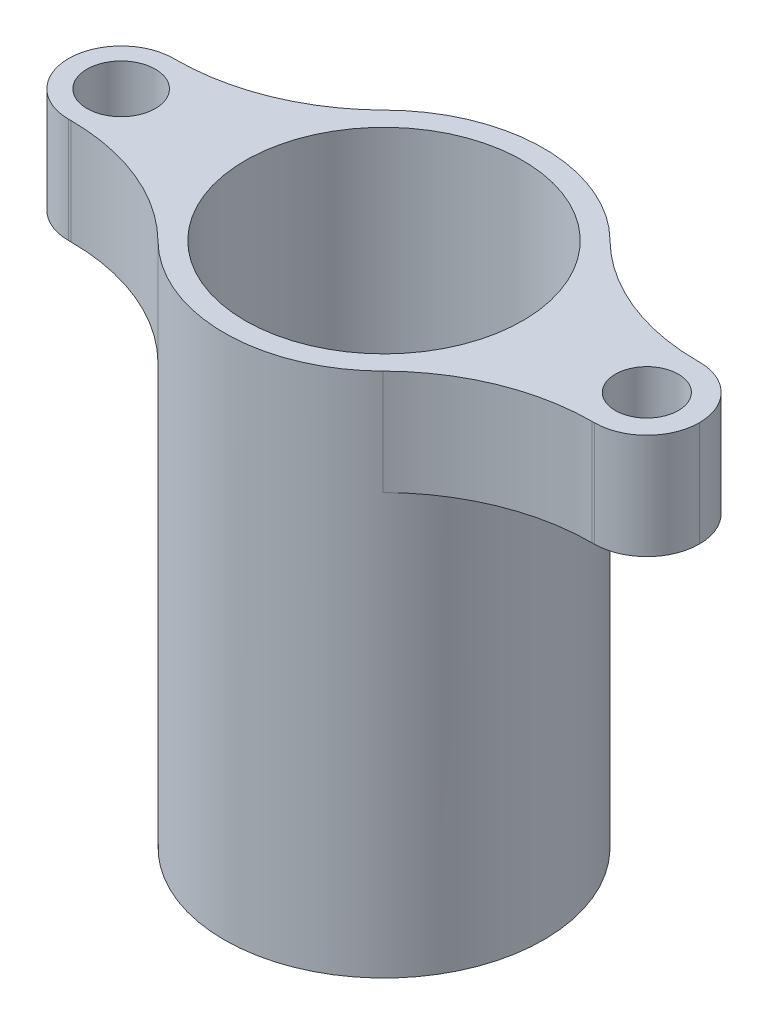
ISO-10303-21;
HEADER;
FILE_DESCRIPTION(('STEP AP214'),'2;1');
FILE_NAME('part.step','',(''),(''),'','','');
FILE_SCHEMA(('AUTOMOTIVE_DESIGN { 1 0 10303 214 1 1 1 1 }'));
ENDSEC;
DATA;
#1=APPLICATION_CONTEXT('core data for automotive mechanical design processes');
#2=APPLICATION_PROTOCOL_DEFINITION('international standard','automotive_design',2000,#1);
#3=PRODUCT_CONTEXT('',#1,'mechanical');
#4=PRODUCT('Part','Part','',(#3));
#5=PRODUCT_RELATED_PRODUCT_CATEGORY('part','',(#4));
#6=PRODUCT_DEFINITION_FORMATION('','',#4);
#7=PRODUCT_DEFINITION_CONTEXT('part definition',#1,'design');
#8=PRODUCT_DEFINITION('design','',#6,#7);
#9=PRODUCT_DEFINITION_SHAPE('','',#8);
#10=(LENGTH_UNIT() NAMED_UNIT(*) SI_UNIT(.MILLI.,.METRE.));
#11=(NAMED_UNIT(*) PLANE_ANGLE_UNIT() SI_UNIT($,.RADIAN.));
#12=(NAMED_UNIT(*) SI_UNIT($,.STERADIAN.) SOLID_ANGLE_UNIT());
#13=UNCERTAINTY_MEASURE_WITH_UNIT(LENGTH_MEASURE(1.E-05),#10,'distance_accuracy_value','');
#14=(GEOMETRIC_REPRESENTATION_CONTEXT(3) GLOBAL_UNCERTAINTY_ASSIGNED_CONTEXT((#13)) GLOBAL_UNIT_ASSIGNED_CONTEXT((#10,
#11,#12)) REPRESENTATION_CONTEXT('',''));
#15=CARTESIAN_POINT('',(0.,0.,0.));
#16=DIRECTION('',(0.,0.,1.));
#17=DIRECTION('',(1.,0.,0.));
#18=AXIS2_PLACEMENT_3D('',#15,#16,#17);
#19=CARTESIAN_POINT('',(0.,25.,0.));
#20=DIRECTION('',(0.,1.,0.));
#21=DIRECTION('',(0.,0.,1.));
#22=AXIS2_PLACEMENT_3D('',#19,#20,#21);
#23=PLANE('',#22);
#24=DIRECTION('',(1.,0.,0.));
#25=VECTOR('',#24,1.);
#26=CARTESIAN_POINT('',(15.,25.,2.5));
#27=LINE('',#26,#25);
#28=CARTESIAN_POINT('',(12.3899152539475,25.,2.5));
#29=VERTEX_POINT('',#28);
#30=CARTESIAN_POINT('',(12.5,25.,2.5));
#31=VERTEX_POINT('',#30);
#32=EDGE_CURVE('E333',#29,#31,#27,.T.);
#33=ORIENTED_EDGE('',*,*,#32,.T.);
#34=CARTESIAN_POINT('',(12.5,25.,0.));
#35=DIRECTION('',(0.,1.,0.));
#36=DIRECTION('',(0.,0.,1.));
#37=AXIS2_PLACEMENT_3D('',#34,#35,#36);
#38=CIRCLE('',#37,2.5);
#39=CARTESIAN_POINT('',(15.,25.,0.));
#40=VERTEX_POINT('',#39);
#41=EDGE_CURVE('E233',#31,#40,#38,.T.);
#42=ORIENTED_EDGE('',*,*,#41,.T.);
#43=CARTESIAN_POINT('',(12.5,25.,0.));
#44=DIRECTION('',(0.,1.,0.));
#45=DIRECTION('',(0.,0.,1.));
#46=AXIS2_PLACEMENT_3D('',#43,#44,#45);
#47=CIRCLE('',#46,2.5);
#48=CARTESIAN_POINT('',(12.5,25.,-2.5));
#49=VERTEX_POINT('',#48);
#50=EDGE_CURVE('E230',#40,#49,#47,.T.);
#51=ORIENTED_EDGE('',*,*,#50,.T.);
#52=DIRECTION('',(-1.,0.,0.));
#53=VECTOR('',#52,1.);
#54=CARTESIAN_POINT('',(15.,25.,-2.5));
#55=LINE('',#54,#53);
#56=CARTESIAN_POINT('',(12.3899152539475,25.,-2.5));
#57=VERTEX_POINT('',#56);
#58=EDGE_CURVE('E315',#49,#57,#55,.T.);
#59=ORIENTED_EDGE('',*,*,#58,.T.);
#60=CARTESIAN_POINT('',(12.3899152539475,25.,-12.5));
#61=DIRECTION('',(0.,1.,0.));
#62=DIRECTION('',(0.,0.,1.));
#63=AXIS2_PLACEMENT_3D('',#60,#61,#62);
#64=CIRCLE('',#63,10.);
#65=CARTESIAN_POINT('',(5.35019067784095,25.,-5.39772727272727));
#66=VERTEX_POINT('',#65);
#67=EDGE_CURVE('E210',#57,#66,#64,.F.);
#68=ORIENTED_EDGE('',*,*,#67,.T.);
#69=CARTESIAN_POINT('',(0.,25.,0.));
#70=DIRECTION('',(0.,1.,0.));
#71=DIRECTION('',(0.,0.,1.));
#72=AXIS2_PLACEMENT_3D('',#69,#70,#71);
#73=CIRCLE('',#72,7.6);
#74=CARTESIAN_POINT('',(-5.35019067784095,25.,-5.39772727272727));
#75=VERTEX_POINT('',#74);
#76=EDGE_CURVE('E170',#66,#75,#73,.T.);
#77=ORIENTED_EDGE('',*,*,#76,.T.);
#78=CARTESIAN_POINT('',(-12.3899152539475,25.,-12.5));
#79=DIRECTION('',(0.,1.,0.));
#80=DIRECTION('',(0.,0.,1.));
#81=AXIS2_PLACEMENT_3D('',#78,#79,#80);
#82=CIRCLE('',#81,10.);
#83=CARTESIAN_POINT('',(-12.3899152539475,25.,-2.5));
#84=VERTEX_POINT('',#83);
#85=EDGE_CURVE('E213',#75,#84,#82,.F.);
#86=ORIENTED_EDGE('',*,*,#85,.T.);
#87=DIRECTION('',(-1.,0.,0.));
#88=VECTOR('',#87,1.);
#89=CARTESIAN_POINT('',(-6.10819122163018,25.,-2.5));
#90=LINE('',#89,#88);
#91=CARTESIAN_POINT('',(-12.5,25.,-2.5));
#92=VERTEX_POINT('',#91);
#93=EDGE_CURVE('E277',#84,#92,#90,.T.);
#94=ORIENTED_EDGE('',*,*,#93,.T.);
#95=CARTESIAN_POINT('',(-12.5,25.,0.));
#96=DIRECTION('',(0.,1.,0.));
#97=DIRECTION('',(0.,0.,1.));
#98=AXIS2_PLACEMENT_3D('',#95,#96,#97);
#99=CIRCLE('',#98,2.5);
#100=CARTESIAN_POINT('',(-15.,25.,0.));
#101=VERTEX_POINT('',#100);
#102=EDGE_CURVE('E224',#92,#101,#99,.T.);
#103=ORIENTED_EDGE('',*,*,#102,.T.);
#104=CARTESIAN_POINT('',(-12.5,25.,0.));
#105=DIRECTION('',(0.,1.,0.));
#106=DIRECTION('',(0.,0.,1.));
#107=AXIS2_PLACEMENT_3D('',#104,#105,#106);
#108=CIRCLE('',#107,2.5);
#109=CARTESIAN_POINT('',(-12.5,25.,2.5));
#110=VERTEX_POINT('',#109);
#111=EDGE_CURVE('E227',#101,#110,#108,.T.);
#112=ORIENTED_EDGE('',*,*,#111,.T.);
#113=DIRECTION('',(1.,0.,0.));
#114=VECTOR('',#113,1.);
#115=CARTESIAN_POINT('',(-6.10819122163018,25.,2.5));
#116=LINE('',#115,#114);
#117=CARTESIAN_POINT('',(-12.3899152539475,25.,2.5));
#118=VERTEX_POINT('',#117);
#119=EDGE_CURVE('E151',#110,#118,#116,.T.);
#120=ORIENTED_EDGE('',*,*,#119,.T.);
#121=CARTESIAN_POINT('',(-12.3899152539475,25.,12.5));
#122=DIRECTION('',(0.,1.,0.));
#123=DIRECTION('',(0.,0.,1.));
#124=AXIS2_PLACEMENT_3D('',#121,#122,#123);
#125=CIRCLE('',#124,10.);
#126=CARTESIAN_POINT('',(-5.35019067784095,25.,5.39772727272727));
#127=VERTEX_POINT('',#126);
#128=EDGE_CURVE('E145',#118,#127,#125,.F.);
#129=ORIENTED_EDGE('',*,*,#128,.T.);
#130=CARTESIAN_POINT('',(5.35019067784095,25.,5.39772727272727));
#131=VERTEX_POINT('',#130);
#132=EDGE_CURVE('E149',#127,#131,#73,.T.);
#133=ORIENTED_EDGE('',*,*,#132,.T.);
#134=CARTESIAN_POINT('',(12.3899152539475,25.,12.5));
#135=DIRECTION('',(0.,1.,0.));
#136=DIRECTION('',(0.,0.,1.));
#137=AXIS2_PLACEMENT_3D('',#134,#135,#136);
#138=CIRCLE('',#137,10.);
#139=EDGE_CURVE('E198',#131,#29,#138,.F.);
#140=ORIENTED_EDGE('',*,*,#139,.T.);
#141=EDGE_LOOP('',(#33,#42,#51,#59,#68,#77,#86,#94,#103,#112,#120,#129,#133,#140));
#142=FACE_BOUND('',#141,.T.);
#143=CARTESIAN_POINT('',(0.,25.,0.));
#144=DIRECTION('',(0.,1.,0.));
#145=DIRECTION('',(0.,0.,1.));
#146=AXIS2_PLACEMENT_3D('',#143,#144,#145);
#147=CIRCLE('',#146,6.6);
#148=CARTESIAN_POINT('',(0.,25.,6.6));
#149=VERTEX_POINT('',#148);
#150=EDGE_CURVE('E295',#149,#149,#147,.T.);
#151=ORIENTED_EDGE('',*,*,#150,.F.);
#152=EDGE_LOOP('',(#151));
#153=FACE_BOUND('',#152,.T.);
#154=CARTESIAN_POINT('',(-12.5,25.,0.));
#155=DIRECTION('',(0.,1.,0.));
#156=DIRECTION('',(0.,0.,1.));
#157=AXIS2_PLACEMENT_3D('',#154,#155,#156);
#158=CIRCLE('',#157,1.625);
#159=CARTESIAN_POINT('',(-12.5,25.,1.625));
#160=VERTEX_POINT('',#159);
#161=EDGE_CURVE('E323',#160,#160,#158,.T.);
#162=ORIENTED_EDGE('',*,*,#161,.F.);
#163=EDGE_LOOP('',(#162));
#164=FACE_BOUND('',#163,.T.);
#165=CARTESIAN_POINT('',(12.5,25.,0.));
#166=DIRECTION('',(0.,1.,0.));
#167=DIRECTION('',(0.,0.,1.));
#168=AXIS2_PLACEMENT_3D('',#165,#166,#167);
#169=CIRCLE('',#168,1.5);
#170=CARTESIAN_POINT('',(12.5,25.,1.5));
#171=VERTEX_POINT('',#170);
#172=EDGE_CURVE('E324',#171,#171,#169,.T.);
#173=ORIENTED_EDGE('',*,*,#172,.F.);
#174=EDGE_LOOP('',(#173));
#175=FACE_BOUND('',#174,.T.);
#176=ADVANCED_FACE('F44',(#142,#153,#164,#175),#23,.T.);
#177=CARTESIAN_POINT('',(0.,0.,0.));
#178=DIRECTION('',(0.,1.,0.));
#179=DIRECTION('',(0.,0.,1.));
#180=AXIS2_PLACEMENT_3D('',#177,#178,#179);
#181=PLANE('',#180);
#182=CARTESIAN_POINT('',(0.,0.,0.));
#183=DIRECTION('',(0.,1.,0.));
#184=DIRECTION('',(0.,0.,1.));
#185=AXIS2_PLACEMENT_3D('',#182,#183,#184);
#186=CIRCLE('',#185,7.6);
#187=CARTESIAN_POINT('',(0.,0.,7.6));
#188=VERTEX_POINT('',#187);
#189=EDGE_CURVE('E299',#188,#188,#186,.T.);
#190=ORIENTED_EDGE('',*,*,#189,.F.);
#191=EDGE_LOOP('',(#190));
#192=FACE_BOUND('',#191,.T.);
#193=CARTESIAN_POINT('',(0.,0.,0.));
#194=DIRECTION('',(0.,1.,0.));
#195=DIRECTION('',(0.,0.,1.));
#196=AXIS2_PLACEMENT_3D('',#193,#194,#195);
#197=CIRCLE('',#196,6.6);
#198=CARTESIAN_POINT('',(0.,0.,6.6));
#199=VERTEX_POINT('',#198);
#200=EDGE_CURVE('E294',#199,#199,#197,.T.);
#201=ORIENTED_EDGE('',*,*,#200,.T.);
#202=EDGE_LOOP('',(#201));
#203=FACE_BOUND('',#202,.T.);
#204=ADVANCED_FACE('F363',(#192,#203),#181,.F.);
#205=CARTESIAN_POINT('',(0.,25.,0.));
#206=DIRECTION('',(0.,-1.,0.));
#207=DIRECTION('',(0.,0.,-1.));
#208=AXIS2_PLACEMENT_3D('',#205,#206,#207);
#209=CYLINDRICAL_SURFACE('',#208,7.6);
#210=CARTESIAN_POINT('',(0.,20.,0.));
#211=DIRECTION('',(0.,1.,0.));
#212=DIRECTION('',(0.,0.,1.));
#213=AXIS2_PLACEMENT_3D('',#210,#211,#212);
#214=CIRCLE('',#213,7.6);
#215=CARTESIAN_POINT('',(5.35019067784095,20.,5.39772727272727));
#216=VERTEX_POINT('',#215);
#217=CARTESIAN_POINT('',(5.35019067784095,20.,-5.39772727272727));
#218=VERTEX_POINT('',#217);
#219=EDGE_CURVE('E320',#216,#218,#214,.T.);
#220=ORIENTED_EDGE('',*,*,#219,.F.);
#221=DIRECTION('',(0.,-1.,0.));
#222=VECTOR('',#221,1.);
#223=CARTESIAN_POINT('',(5.35019067784095,25.,5.39772727272727));
#224=LINE('',#223,#222);
#225=EDGE_CURVE('E167',#216,#131,#224,.F.);
#226=ORIENTED_EDGE('',*,*,#225,.T.);
#227=ORIENTED_EDGE('',*,*,#132,.F.);
#228=DIRECTION('',(0.,-1.,0.));
#229=VECTOR('',#228,1.);
#230=CARTESIAN_POINT('',(-5.35019067784095,25.,5.39772727272727));
#231=LINE('',#230,#229);
#232=CARTESIAN_POINT('',(-5.35019067784095,20.,5.39772727272727));
#233=VERTEX_POINT('',#232);
#234=EDGE_CURVE('E165',#127,#233,#231,.T.);
#235=ORIENTED_EDGE('',*,*,#234,.T.);
#236=CARTESIAN_POINT('',(0.,20.,0.));
#237=DIRECTION('',(0.,1.,0.));
#238=DIRECTION('',(0.,0.,1.));
#239=AXIS2_PLACEMENT_3D('',#236,#237,#238);
#240=CIRCLE('',#239,7.6);
#241=CARTESIAN_POINT('',(-5.35019067784095,20.,-5.39772727272727));
#242=VERTEX_POINT('',#241);
#243=EDGE_CURVE('E291',#242,#233,#240,.T.);
#244=ORIENTED_EDGE('',*,*,#243,.F.);
#245=DIRECTION('',(0.,-1.,0.));
#246=VECTOR('',#245,1.);
#247=CARTESIAN_POINT('',(-5.35019067784095,25.,-5.39772727272727));
#248=LINE('',#247,#246);
#249=EDGE_CURVE('E169',#242,#75,#248,.F.);
#250=ORIENTED_EDGE('',*,*,#249,.T.);
#251=ORIENTED_EDGE('',*,*,#76,.F.);
#252=DIRECTION('',(0.,-1.,0.));
#253=VECTOR('',#252,1.);
#254=CARTESIAN_POINT('',(5.35019067784095,25.,-5.39772727272727));
#255=LINE('',#254,#253);
#256=EDGE_CURVE('E176',#66,#218,#255,.T.);
#257=ORIENTED_EDGE('',*,*,#256,.T.);
#258=EDGE_LOOP('',(#220,#226,#227,#235,#244,#250,#251,#257));
#259=FACE_BOUND('',#258,.T.);
#260=ORIENTED_EDGE('',*,*,#189,.T.);
#261=EDGE_LOOP('',(#260));
#262=FACE_BOUND('',#261,.T.);
#263=ADVANCED_FACE('F163',(#259,#262),#209,.T.);
#264=CARTESIAN_POINT('',(0.,25.,0.));
#265=DIRECTION('',(0.,-1.,0.));
#266=DIRECTION('',(0.,0.,-1.));
#267=AXIS2_PLACEMENT_3D('',#264,#265,#266);
#268=CYLINDRICAL_SURFACE('',#267,6.6);
#269=ORIENTED_EDGE('',*,*,#150,.T.);
#270=EDGE_LOOP('',(#269));
#271=FACE_BOUND('',#270,.T.);
#272=ORIENTED_EDGE('',*,*,#200,.F.);
#273=EDGE_LOOP('',(#272));
#274=FACE_BOUND('',#273,.T.);
#275=ADVANCED_FACE('F393',(#271,#274),#268,.F.);
#276=CARTESIAN_POINT('',(-6.10819122163018,20.,-2.5));
#277=DIRECTION('',(0.,0.,-1.));
#278=DIRECTION('',(-1.,0.,0.));
#279=AXIS2_PLACEMENT_3D('',#276,#277,#278);
#280=PLANE('',#279);
#281=DIRECTION('',(-1.,0.,0.));
#282=VECTOR('',#281,1.);
#283=CARTESIAN_POINT('',(-6.10819122163018,20.,-2.5));
#284=LINE('',#283,#282);
#285=CARTESIAN_POINT('',(-12.3899152539475,20.,-2.5));
#286=VERTEX_POINT('',#285);
#287=CARTESIAN_POINT('',(-12.5,20.,-2.5));
#288=VERTEX_POINT('',#287);
#289=EDGE_CURVE('E279',#286,#288,#284,.T.);
#290=ORIENTED_EDGE('',*,*,#289,.T.);
#291=DIRECTION('',(0.,1.,0.));
#292=VECTOR('',#291,1.);
#293=CARTESIAN_POINT('',(-12.5,20.,-2.5));
#294=LINE('',#293,#292);
#295=EDGE_CURVE('E11',#288,#92,#294,.T.);
#296=ORIENTED_EDGE('',*,*,#295,.T.);
#297=ORIENTED_EDGE('',*,*,#93,.F.);
#298=DIRECTION('',(0.,-1.,0.));
#299=VECTOR('',#298,1.);
#300=CARTESIAN_POINT('',(-12.3899152539475,20.,-2.5));
#301=LINE('',#300,#299);
#302=EDGE_CURVE('E195',#84,#286,#301,.T.);
#303=ORIENTED_EDGE('',*,*,#302,.T.);
#304=EDGE_LOOP('',(#290,#296,#297,#303));
#305=FACE_BOUND('',#304,.T.);
#306=ADVANCED_FACE('F276',(#305),#280,.T.);
#307=CARTESIAN_POINT('',(-6.10819122163018,20.,2.5));
#308=DIRECTION('',(0.,0.,1.));
#309=DIRECTION('',(1.,0.,0.));
#310=AXIS2_PLACEMENT_3D('',#307,#308,#309);
#311=PLANE('',#310);
#312=ORIENTED_EDGE('',*,*,#119,.F.);
#313=DIRECTION('',(0.,1.,0.));
#314=VECTOR('',#313,1.);
#315=CARTESIAN_POINT('',(-12.5,20.,2.5));
#316=LINE('',#315,#314);
#317=CARTESIAN_POINT('',(-12.5,20.,2.5));
#318=VERTEX_POINT('',#317);
#319=EDGE_CURVE('E245',#110,#318,#316,.F.);
#320=ORIENTED_EDGE('',*,*,#319,.T.);
#321=DIRECTION('',(1.,0.,0.));
#322=VECTOR('',#321,1.);
#323=CARTESIAN_POINT('',(-6.10819122163018,20.,2.5));
#324=LINE('',#323,#322);
#325=CARTESIAN_POINT('',(-12.3899152539475,20.,2.5));
#326=VERTEX_POINT('',#325);
#327=EDGE_CURVE('E282',#318,#326,#324,.T.);
#328=ORIENTED_EDGE('',*,*,#327,.T.);
#329=DIRECTION('',(0.,-1.,0.));
#330=VECTOR('',#329,1.);
#331=CARTESIAN_POINT('',(-12.3899152539475,20.,2.5));
#332=LINE('',#331,#330);
#333=EDGE_CURVE('E188',#326,#118,#332,.F.);
#334=ORIENTED_EDGE('',*,*,#333,.T.);
#335=EDGE_LOOP('',(#312,#320,#328,#334));
#336=FACE_BOUND('',#335,.T.);
#337=ADVANCED_FACE('F389',(#336),#311,.T.);
#338=CARTESIAN_POINT('',(0.,20.,0.));
#339=DIRECTION('',(0.,1.,0.));
#340=DIRECTION('',(0.,0.,1.));
#341=AXIS2_PLACEMENT_3D('',#338,#339,#340);
#342=PLANE('',#341);
#343=CARTESIAN_POINT('',(-12.5,20.,0.));
#344=DIRECTION('',(0.,1.,0.));
#345=DIRECTION('',(0.,0.,1.));
#346=AXIS2_PLACEMENT_3D('',#343,#344,#345);
#347=CIRCLE('',#346,1.625);
#348=CARTESIAN_POINT('',(-12.5,20.,1.625));
#349=VERTEX_POINT('',#348);
#350=EDGE_CURVE('E287',#349,#349,#347,.T.);
#351=ORIENTED_EDGE('',*,*,#350,.T.);
#352=EDGE_LOOP('',(#351));
#353=FACE_BOUND('',#352,.T.);
#354=ORIENTED_EDGE('',*,*,#327,.F.);
#355=CARTESIAN_POINT('',(-12.5,20.,0.));
#356=DIRECTION('',(0.,1.,0.));
#357=DIRECTION('',(0.,0.,1.));
#358=AXIS2_PLACEMENT_3D('',#355,#356,#357);
#359=CIRCLE('',#358,2.5);
#360=CARTESIAN_POINT('',(-15.,20.,0.));
#361=VERTEX_POINT('',#360);
#362=EDGE_CURVE('E54',#318,#361,#359,.F.);
#363=ORIENTED_EDGE('',*,*,#362,.T.);
#364=CARTESIAN_POINT('',(-12.5,20.,0.));
#365=DIRECTION('',(0.,1.,0.));
#366=DIRECTION('',(0.,0.,1.));
#367=AXIS2_PLACEMENT_3D('',#364,#365,#366);
#368=CIRCLE('',#367,2.5);
#369=EDGE_CURVE('E65',#361,#288,#368,.F.);
#370=ORIENTED_EDGE('',*,*,#369,.T.);
#371=ORIENTED_EDGE('',*,*,#289,.F.);
#372=CARTESIAN_POINT('',(-12.3899152539475,20.,-12.5));
#373=DIRECTION('',(0.,1.,0.));
#374=DIRECTION('',(0.,0.,1.));
#375=AXIS2_PLACEMENT_3D('',#372,#373,#374);
#376=CIRCLE('',#375,10.);
#377=EDGE_CURVE('E216',#286,#242,#376,.T.);
#378=ORIENTED_EDGE('',*,*,#377,.T.);
#379=ORIENTED_EDGE('',*,*,#243,.T.);
#380=CARTESIAN_POINT('',(-12.3899152539475,20.,12.5));
#381=DIRECTION('',(0.,1.,0.));
#382=DIRECTION('',(0.,0.,1.));
#383=AXIS2_PLACEMENT_3D('',#380,#381,#382);
#384=CIRCLE('',#383,10.);
#385=EDGE_CURVE('E158',#233,#326,#384,.T.);
#386=ORIENTED_EDGE('',*,*,#385,.T.);
#387=EDGE_LOOP('',(#354,#363,#370,#371,#378,#379,#386));
#388=FACE_BOUND('',#387,.T.);
#389=ADVANCED_FACE('F385',(#353,#388),#342,.F.);
#390=CARTESIAN_POINT('',(-12.5,20.,0.));
#391=DIRECTION('',(0.,1.,0.));
#392=DIRECTION('',(0.,0.,1.));
#393=AXIS2_PLACEMENT_3D('',#390,#391,#392);
#394=CYLINDRICAL_SURFACE('',#393,1.625);
#395=ORIENTED_EDGE('',*,*,#350,.F.);
#396=EDGE_LOOP('',(#395));
#397=FACE_BOUND('',#396,.T.);
#398=ORIENTED_EDGE('',*,*,#161,.T.);
#399=EDGE_LOOP('',(#398));
#400=FACE_BOUND('',#399,.T.);
#401=ADVANCED_FACE('F359',(#397,#400),#394,.F.);
#402=CARTESIAN_POINT('',(15.,20.,2.5));
#403=DIRECTION('',(0.,0.,1.));
#404=DIRECTION('',(1.,0.,0.));
#405=AXIS2_PLACEMENT_3D('',#402,#403,#404);
#406=PLANE('',#405);
#407=DIRECTION('',(1.,0.,0.));
#408=VECTOR('',#407,1.);
#409=CARTESIAN_POINT('',(15.,20.,2.5));
#410=LINE('',#409,#408);
#411=CARTESIAN_POINT('',(12.3899152539475,20.,2.5));
#412=VERTEX_POINT('',#411);
#413=CARTESIAN_POINT('',(12.5,20.,2.5));
#414=VERTEX_POINT('',#413);
#415=EDGE_CURVE('E255',#412,#414,#410,.T.);
#416=ORIENTED_EDGE('',*,*,#415,.T.);
#417=DIRECTION('',(0.,1.,0.));
#418=VECTOR('',#417,1.);
#419=CARTESIAN_POINT('',(12.5,20.,2.5));
#420=LINE('',#419,#418);
#421=EDGE_CURVE('E220',#414,#31,#420,.T.);
#422=ORIENTED_EDGE('',*,*,#421,.T.);
#423=ORIENTED_EDGE('',*,*,#32,.F.);
#424=DIRECTION('',(0.,-1.,0.));
#425=VECTOR('',#424,1.);
#426=CARTESIAN_POINT('',(12.3899152539475,20.,2.5));
#427=LINE('',#426,#425);
#428=EDGE_CURVE('E180',#29,#412,#427,.T.);
#429=ORIENTED_EDGE('',*,*,#428,.T.);
#430=EDGE_LOOP('',(#416,#422,#423,#429));
#431=FACE_BOUND('',#430,.T.);
#432=ADVANCED_FACE('F335',(#431),#406,.T.);
#433=CARTESIAN_POINT('',(15.,20.,-2.5));
#434=DIRECTION('',(0.,0.,-1.));
#435=DIRECTION('',(-1.,0.,0.));
#436=AXIS2_PLACEMENT_3D('',#433,#434,#435);
#437=PLANE('',#436);
#438=ORIENTED_EDGE('',*,*,#58,.F.);
#439=DIRECTION('',(0.,1.,0.));
#440=VECTOR('',#439,1.);
#441=CARTESIAN_POINT('',(12.5,20.,-2.5));
#442=LINE('',#441,#440);
#443=CARTESIAN_POINT('',(12.5,20.,-2.5));
#444=VERTEX_POINT('',#443);
#445=EDGE_CURVE('E242',#49,#444,#442,.F.);
#446=ORIENTED_EDGE('',*,*,#445,.T.);
#447=DIRECTION('',(-1.,0.,0.));
#448=VECTOR('',#447,1.);
#449=CARTESIAN_POINT('',(15.,20.,-2.5));
#450=LINE('',#449,#448);
#451=CARTESIAN_POINT('',(12.3899152539475,20.,-2.5));
#452=VERTEX_POINT('',#451);
#453=EDGE_CURVE('E262',#444,#452,#450,.T.);
#454=ORIENTED_EDGE('',*,*,#453,.T.);
#455=DIRECTION('',(0.,-1.,0.));
#456=VECTOR('',#455,1.);
#457=CARTESIAN_POINT('',(12.3899152539475,20.,-2.5));
#458=LINE('',#457,#456);
#459=EDGE_CURVE('E191',#452,#57,#458,.F.);
#460=ORIENTED_EDGE('',*,*,#459,.T.);
#461=EDGE_LOOP('',(#438,#446,#454,#460));
#462=FACE_BOUND('',#461,.T.);
#463=ADVANCED_FACE('F378',(#462),#437,.T.);
#464=CARTESIAN_POINT('',(0.,20.,0.));
#465=DIRECTION('',(0.,1.,0.));
#466=DIRECTION('',(0.,0.,1.));
#467=AXIS2_PLACEMENT_3D('',#464,#465,#466);
#468=PLANE('',#467);
#469=CARTESIAN_POINT('',(12.5,20.,0.));
#470=DIRECTION('',(0.,1.,0.));
#471=DIRECTION('',(0.,0.,1.));
#472=AXIS2_PLACEMENT_3D('',#469,#470,#471);
#473=CIRCLE('',#472,1.5);
#474=CARTESIAN_POINT('',(12.5,20.,1.5));
#475=VERTEX_POINT('',#474);
#476=EDGE_CURVE('E341',#475,#475,#473,.T.);
#477=ORIENTED_EDGE('',*,*,#476,.T.);
#478=EDGE_LOOP('',(#477));
#479=FACE_BOUND('',#478,.T.);
#480=CARTESIAN_POINT('',(12.5,20.,0.));
#481=DIRECTION('',(0.,1.,0.));
#482=DIRECTION('',(0.,0.,1.));
#483=AXIS2_PLACEMENT_3D('',#480,#481,#482);
#484=CIRCLE('',#483,2.5);
#485=CARTESIAN_POINT('',(15.,20.,0.));
#486=VERTEX_POINT('',#485);
#487=EDGE_CURVE('E236',#444,#486,#484,.F.);
#488=ORIENTED_EDGE('',*,*,#487,.T.);
#489=CARTESIAN_POINT('',(12.5,20.,0.));
#490=DIRECTION('',(0.,1.,0.));
#491=DIRECTION('',(0.,0.,1.));
#492=AXIS2_PLACEMENT_3D('',#489,#490,#491);
#493=CIRCLE('',#492,2.5);
#494=EDGE_CURVE('E239',#486,#414,#493,.F.);
#495=ORIENTED_EDGE('',*,*,#494,.T.);
#496=ORIENTED_EDGE('',*,*,#415,.F.);
#497=CARTESIAN_POINT('',(12.3899152539475,20.,12.5));
#498=DIRECTION('',(0.,1.,0.));
#499=DIRECTION('',(0.,0.,1.));
#500=AXIS2_PLACEMENT_3D('',#497,#498,#499);
#501=CIRCLE('',#500,10.);
#502=EDGE_CURVE('E201',#412,#216,#501,.T.);
#503=ORIENTED_EDGE('',*,*,#502,.T.);
#504=ORIENTED_EDGE('',*,*,#219,.T.);
#505=CARTESIAN_POINT('',(12.3899152539475,20.,-12.5));
#506=DIRECTION('',(0.,1.,0.));
#507=DIRECTION('',(0.,0.,1.));
#508=AXIS2_PLACEMENT_3D('',#505,#506,#507);
#509=CIRCLE('',#508,10.);
#510=EDGE_CURVE('E157',#218,#452,#509,.T.);
#511=ORIENTED_EDGE('',*,*,#510,.T.);
#512=ORIENTED_EDGE('',*,*,#453,.F.);
#513=EDGE_LOOP('',(#488,#495,#496,#503,#504,#511,#512));
#514=FACE_BOUND('',#513,.T.);
#515=ADVANCED_FACE('F328',(#479,#514),#468,.F.);
#516=CARTESIAN_POINT('',(12.5,20.,0.));
#517=DIRECTION('',(0.,1.,0.));
#518=DIRECTION('',(0.,0.,1.));
#519=AXIS2_PLACEMENT_3D('',#516,#517,#518);
#520=CYLINDRICAL_SURFACE('',#519,1.5);
#521=ORIENTED_EDGE('',*,*,#476,.F.);
#522=EDGE_LOOP('',(#521));
#523=FACE_BOUND('',#522,.T.);
#524=ORIENTED_EDGE('',*,*,#172,.T.);
#525=EDGE_LOOP('',(#524));
#526=FACE_BOUND('',#525,.T.);
#527=ADVANCED_FACE('F367',(#523,#526),#520,.F.);
#528=CARTESIAN_POINT('',(12.3899152539475,25.,12.5));
#529=DIRECTION('',(0.,-1.,0.));
#530=DIRECTION('',(0.,0.,-1.));
#531=AXIS2_PLACEMENT_3D('',#528,#529,#530);
#532=CYLINDRICAL_SURFACE('',#531,10.);
#533=ORIENTED_EDGE('',*,*,#502,.F.);
#534=ORIENTED_EDGE('',*,*,#428,.F.);
#535=ORIENTED_EDGE('',*,*,#139,.F.);
#536=ORIENTED_EDGE('',*,*,#225,.F.);
#537=EDGE_LOOP('',(#533,#534,#535,#536));
#538=FACE_BOUND('',#537,.T.);
#539=ADVANCED_FACE('F331',(#538),#532,.F.);
#540=CARTESIAN_POINT('',(-12.3899152539475,25.,12.5));
#541=DIRECTION('',(0.,-1.,0.));
#542=DIRECTION('',(0.,0.,-1.));
#543=AXIS2_PLACEMENT_3D('',#540,#541,#542);
#544=CYLINDRICAL_SURFACE('',#543,10.);
#545=ORIENTED_EDGE('',*,*,#128,.F.);
#546=ORIENTED_EDGE('',*,*,#333,.F.);
#547=ORIENTED_EDGE('',*,*,#385,.F.);
#548=ORIENTED_EDGE('',*,*,#234,.F.);
#549=EDGE_LOOP('',(#545,#546,#547,#548));
#550=FACE_BOUND('',#549,.T.);
#551=ADVANCED_FACE('F173',(#550),#544,.F.);
#552=CARTESIAN_POINT('',(12.3899152539475,25.,-12.5));
#553=DIRECTION('',(0.,-1.,0.));
#554=DIRECTION('',(0.,0.,-1.));
#555=AXIS2_PLACEMENT_3D('',#552,#553,#554);
#556=CYLINDRICAL_SURFACE('',#555,10.);
#557=ORIENTED_EDGE('',*,*,#67,.F.);
#558=ORIENTED_EDGE('',*,*,#459,.F.);
#559=ORIENTED_EDGE('',*,*,#510,.F.);
#560=ORIENTED_EDGE('',*,*,#256,.F.);
#561=EDGE_LOOP('',(#557,#558,#559,#560));
#562=FACE_BOUND('',#561,.T.);
#563=ADVANCED_FACE('F318',(#562),#556,.F.);
#564=CARTESIAN_POINT('',(-12.3899152539475,25.,-12.5));
#565=DIRECTION('',(0.,-1.,0.));
#566=DIRECTION('',(0.,0.,-1.));
#567=AXIS2_PLACEMENT_3D('',#564,#565,#566);
#568=CYLINDRICAL_SURFACE('',#567,10.);
#569=ORIENTED_EDGE('',*,*,#377,.F.);
#570=ORIENTED_EDGE('',*,*,#302,.F.);
#571=ORIENTED_EDGE('',*,*,#85,.F.);
#572=ORIENTED_EDGE('',*,*,#249,.F.);
#573=EDGE_LOOP('',(#569,#570,#571,#572));
#574=FACE_BOUND('',#573,.T.);
#575=ADVANCED_FACE('F408',(#574),#568,.F.);
#576=CARTESIAN_POINT('',(12.5,20.,0.));
#577=DIRECTION('',(0.,1.,0.));
#578=DIRECTION('',(0.,0.,1.));
#579=AXIS2_PLACEMENT_3D('',#576,#577,#578);
#580=CYLINDRICAL_SURFACE('',#579,2.5);
#581=DIRECTION('',(0.,1.,0.));
#582=VECTOR('',#581,1.);
#583=CARTESIAN_POINT('',(15.,20.,0.));
#584=LINE('',#583,#582);
#585=EDGE_CURVE('E252',#486,#40,#584,.T.);
#586=ORIENTED_EDGE('',*,*,#585,.F.);
#587=ORIENTED_EDGE('',*,*,#487,.F.);
#588=ORIENTED_EDGE('',*,*,#445,.F.);
#589=ORIENTED_EDGE('',*,*,#50,.F.);
#590=EDGE_LOOP('',(#586,#587,#588,#589));
#591=FACE_BOUND('',#590,.T.);
#592=ADVANCED_FACE('F411',(#591),#580,.T.);
#593=CARTESIAN_POINT('',(12.5,20.,0.));
#594=DIRECTION('',(0.,1.,0.));
#595=DIRECTION('',(0.,0.,1.));
#596=AXIS2_PLACEMENT_3D('',#593,#594,#595);
#597=CYLINDRICAL_SURFACE('',#596,2.5);
#598=ORIENTED_EDGE('',*,*,#494,.F.);
#599=ORIENTED_EDGE('',*,*,#585,.T.);
#600=ORIENTED_EDGE('',*,*,#41,.F.);
#601=ORIENTED_EDGE('',*,*,#421,.F.);
#602=EDGE_LOOP('',(#598,#599,#600,#601));
#603=FACE_BOUND('',#602,.T.);
#604=ADVANCED_FACE('F412',(#603),#597,.T.);
#605=CARTESIAN_POINT('',(-12.5,20.,0.));
#606=DIRECTION('',(0.,1.,0.));
#607=DIRECTION('',(0.,0.,1.));
#608=AXIS2_PLACEMENT_3D('',#605,#606,#607);
#609=CYLINDRICAL_SURFACE('',#608,2.5);
#610=ORIENTED_EDGE('',*,*,#295,.F.);
#611=ORIENTED_EDGE('',*,*,#369,.F.);
#612=DIRECTION('',(0.,1.,0.));
#613=VECTOR('',#612,1.);
#614=CARTESIAN_POINT('',(-15.,20.,0.));
#615=LINE('',#614,#613);
#616=EDGE_CURVE('E48',#101,#361,#615,.F.);
#617=ORIENTED_EDGE('',*,*,#616,.F.);
#618=ORIENTED_EDGE('',*,*,#102,.F.);
#619=EDGE_LOOP('',(#610,#611,#617,#618));
#620=FACE_BOUND('',#619,.T.);
#621=ADVANCED_FACE('F46',(#620),#609,.T.);
#622=CARTESIAN_POINT('',(-12.5,20.,0.));
#623=DIRECTION('',(0.,1.,0.));
#624=DIRECTION('',(0.,0.,1.));
#625=AXIS2_PLACEMENT_3D('',#622,#623,#624);
#626=CYLINDRICAL_SURFACE('',#625,2.5);
#627=ORIENTED_EDGE('',*,*,#362,.F.);
#628=ORIENTED_EDGE('',*,*,#319,.F.);
#629=ORIENTED_EDGE('',*,*,#111,.F.);
#630=ORIENTED_EDGE('',*,*,#616,.T.);
#631=EDGE_LOOP('',(#627,#628,#629,#630));
#632=FACE_BOUND('',#631,.T.);
#633=ADVANCED_FACE('F268',(#632),#626,.T.);
#634=CLOSED_SHELL('',(#176,#204,#263,#275,#306,#337,#389,#401,#432,#463,#515,#527,#539,#551,
#563,#575,#592,#604,#621,#633));
#635=MANIFOLD_SOLID_BREP('B2',#634);
#636=ADVANCED_BREP_SHAPE_REPRESENTATION('',(#18,#635),#14);
#637=SHAPE_DEFINITION_REPRESENTATION(#9,#636);
ENDSEC;
END-ISO-10303-21;
